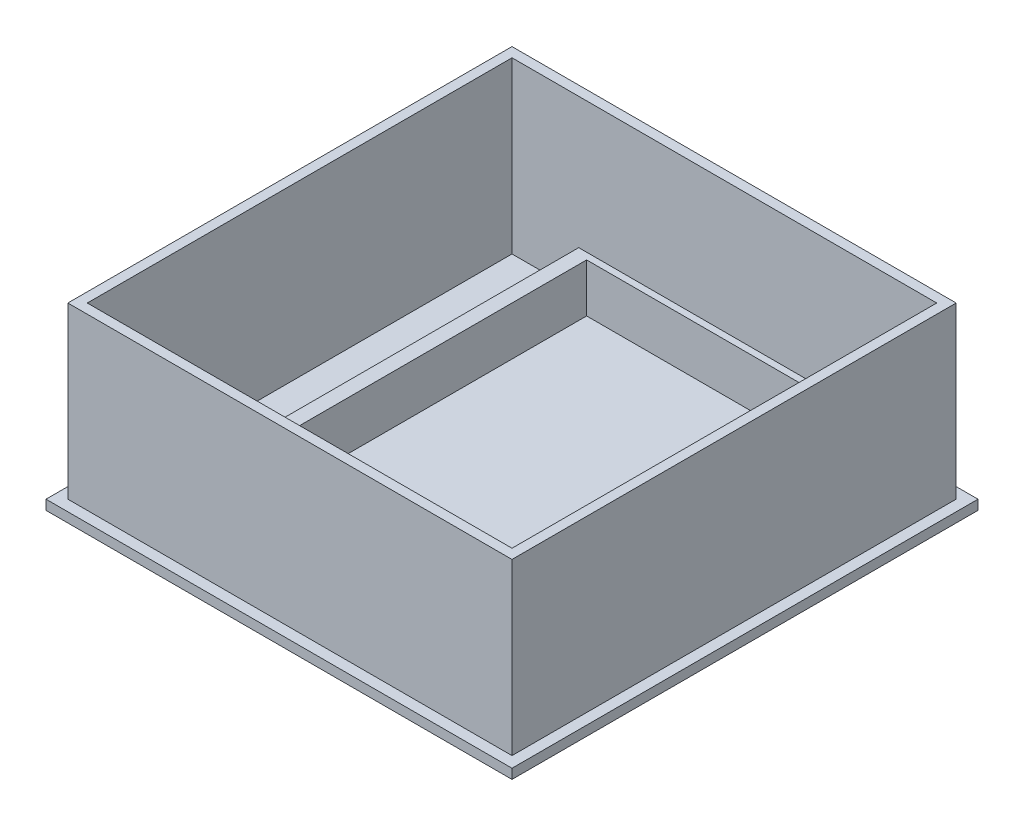
ISO-10303-21;
HEADER;
FILE_DESCRIPTION(('STEP AP214'),'2;1');
FILE_NAME('part.step','',(''),(''),'','','');
FILE_SCHEMA(('AUTOMOTIVE_DESIGN { 1 0 10303 214 1 1 1 1 }'));
ENDSEC;
DATA;
#1=APPLICATION_CONTEXT('core data for automotive mechanical design processes');
#2=APPLICATION_PROTOCOL_DEFINITION('international standard','automotive_design',2000,#1);
#3=PRODUCT_CONTEXT('',#1,'mechanical');
#4=PRODUCT('Part','Part','',(#3));
#5=PRODUCT_RELATED_PRODUCT_CATEGORY('part','',(#4));
#6=PRODUCT_DEFINITION_FORMATION('','',#4);
#7=PRODUCT_DEFINITION_CONTEXT('part definition',#1,'design');
#8=PRODUCT_DEFINITION('design','',#6,#7);
#9=PRODUCT_DEFINITION_SHAPE('','',#8);
#10=(LENGTH_UNIT() NAMED_UNIT(*) SI_UNIT(.MILLI.,.METRE.));
#11=(NAMED_UNIT(*) PLANE_ANGLE_UNIT() SI_UNIT($,.RADIAN.));
#12=(NAMED_UNIT(*) SI_UNIT($,.STERADIAN.) SOLID_ANGLE_UNIT());
#13=UNCERTAINTY_MEASURE_WITH_UNIT(LENGTH_MEASURE(1.E-05),#10,'distance_accuracy_value','');
#14=(GEOMETRIC_REPRESENTATION_CONTEXT(3) GLOBAL_UNCERTAINTY_ASSIGNED_CONTEXT((#13)) GLOBAL_UNIT_ASSIGNED_CONTEXT((#10,
#11,#12)) REPRESENTATION_CONTEXT('',''));
#15=CARTESIAN_POINT('',(0.,0.,0.));
#16=DIRECTION('',(0.,0.,1.));
#17=DIRECTION('',(1.,0.,0.));
#18=AXIS2_PLACEMENT_3D('',#15,#16,#17);
#19=CARTESIAN_POINT('',(0.,4.,0.));
#20=DIRECTION('',(0.,-1.,0.));
#21=DIRECTION('',(0.,0.,-1.));
#22=AXIS2_PLACEMENT_3D('',#19,#20,#21);
#23=PLANE('',#22);
#24=DIRECTION('',(0.,0.,1.));
#25=VECTOR('',#24,1.);
#26=CARTESIAN_POINT('',(-45.75,4.,-45.75));
#27=LINE('',#26,#25);
#28=CARTESIAN_POINT('',(-45.75,4.,-45.75));
#29=VERTEX_POINT('',#28);
#30=CARTESIAN_POINT('',(-45.75,4.,45.75));
#31=VERTEX_POINT('',#30);
#32=EDGE_CURVE('E511',#29,#31,#27,.T.);
#33=ORIENTED_EDGE('',*,*,#32,.F.);
#34=DIRECTION('',(-1.,0.,0.));
#35=VECTOR('',#34,1.);
#36=CARTESIAN_POINT('',(45.75,4.,-45.75));
#37=LINE('',#36,#35);
#38=CARTESIAN_POINT('',(45.75,4.,-45.75));
#39=VERTEX_POINT('',#38);
#40=EDGE_CURVE('E523',#39,#29,#37,.T.);
#41=ORIENTED_EDGE('',*,*,#40,.F.);
#42=DIRECTION('',(0.,0.,-1.));
#43=VECTOR('',#42,1.);
#44=CARTESIAN_POINT('',(45.75,4.,45.75));
#45=LINE('',#44,#43);
#46=CARTESIAN_POINT('',(45.75,4.,45.75));
#47=VERTEX_POINT('',#46);
#48=EDGE_CURVE('E520',#47,#39,#45,.T.);
#49=ORIENTED_EDGE('',*,*,#48,.F.);
#50=DIRECTION('',(1.,0.,0.));
#51=VECTOR('',#50,1.);
#52=CARTESIAN_POINT('',(-45.75,4.,45.75));
#53=LINE('',#52,#51);
#54=EDGE_CURVE('E479',#31,#47,#53,.T.);
#55=ORIENTED_EDGE('',*,*,#54,.F.);
#56=EDGE_LOOP('',(#33,#41,#49,#55));
#57=FACE_BOUND('',#56,.T.);
#58=DIRECTION('',(0.,0.,1.));
#59=VECTOR('',#58,1.);
#60=CARTESIAN_POINT('',(-48.,4.,-48.));
#61=LINE('',#60,#59);
#62=CARTESIAN_POINT('',(-48.,4.,-48.));
#63=VERTEX_POINT('',#62);
#64=CARTESIAN_POINT('',(-48.,4.,48.));
#65=VERTEX_POINT('',#64);
#66=EDGE_CURVE('E938',#63,#65,#61,.T.);
#67=ORIENTED_EDGE('',*,*,#66,.T.);
#68=DIRECTION('',(1.,0.,0.));
#69=VECTOR('',#68,1.);
#70=CARTESIAN_POINT('',(-48.,4.,48.));
#71=LINE('',#70,#69);
#72=CARTESIAN_POINT('',(48.,4.,48.));
#73=VERTEX_POINT('',#72);
#74=EDGE_CURVE('E402',#65,#73,#71,.T.);
#75=ORIENTED_EDGE('',*,*,#74,.T.);
#76=DIRECTION('',(0.,0.,-1.));
#77=VECTOR('',#76,1.);
#78=CARTESIAN_POINT('',(48.,4.,-48.));
#79=LINE('',#78,#77);
#80=CARTESIAN_POINT('',(48.,4.,-48.));
#81=VERTEX_POINT('',#80);
#82=EDGE_CURVE('E409',#73,#81,#79,.T.);
#83=ORIENTED_EDGE('',*,*,#82,.T.);
#84=DIRECTION('',(-1.,0.,0.));
#85=VECTOR('',#84,1.);
#86=CARTESIAN_POINT('',(-48.,4.,-48.));
#87=LINE('',#86,#85);
#88=EDGE_CURVE('E404',#81,#63,#87,.T.);
#89=ORIENTED_EDGE('',*,*,#88,.T.);
#90=EDGE_LOOP('',(#67,#75,#83,#89));
#91=FACE_BOUND('',#90,.T.);
#92=ADVANCED_FACE('F250',(#57,#91),#23,.F.);
#93=CARTESIAN_POINT('',(0.,39.,0.));
#94=DIRECTION('',(0.,1.,0.));
#95=DIRECTION('',(0.,0.,1.));
#96=AXIS2_PLACEMENT_3D('',#93,#94,#95);
#97=PLANE('',#96);
#98=DIRECTION('',(0.,0.,1.));
#99=VECTOR('',#98,1.);
#100=CARTESIAN_POINT('',(-43.7452454031839,39.,-43.75));
#101=LINE('',#100,#99);
#102=CARTESIAN_POINT('',(-43.7452454031839,39.,-43.75));
#103=VERTEX_POINT('',#102);
#104=CARTESIAN_POINT('',(-43.7452454031839,39.,43.75));
#105=VERTEX_POINT('',#104);
#106=EDGE_CURVE('E435',#103,#105,#101,.T.);
#107=ORIENTED_EDGE('',*,*,#106,.F.);
#108=DIRECTION('',(-1.,0.,0.));
#109=VECTOR('',#108,1.);
#110=CARTESIAN_POINT('',(-43.7452454031839,39.,-43.75));
#111=LINE('',#110,#109);
#112=CARTESIAN_POINT('',(43.75,39.,-43.75));
#113=VERTEX_POINT('',#112);
#114=EDGE_CURVE('E443',#113,#103,#111,.T.);
#115=ORIENTED_EDGE('',*,*,#114,.F.);
#116=DIRECTION('',(0.,0.,-1.));
#117=VECTOR('',#116,1.);
#118=CARTESIAN_POINT('',(43.75,39.,-43.75));
#119=LINE('',#118,#117);
#120=CARTESIAN_POINT('',(43.75,39.,43.75));
#121=VERTEX_POINT('',#120);
#122=EDGE_CURVE('E440',#121,#113,#119,.T.);
#123=ORIENTED_EDGE('',*,*,#122,.F.);
#124=DIRECTION('',(1.,0.,0.));
#125=VECTOR('',#124,1.);
#126=CARTESIAN_POINT('',(-43.7452454031839,39.,43.75));
#127=LINE('',#126,#125);
#128=EDGE_CURVE('E437',#105,#121,#127,.T.);
#129=ORIENTED_EDGE('',*,*,#128,.F.);
#130=EDGE_LOOP('',(#107,#115,#123,#129));
#131=FACE_BOUND('',#130,.T.);
#132=DIRECTION('',(1.,0.,0.));
#133=VECTOR('',#132,1.);
#134=CARTESIAN_POINT('',(-45.75,39.,45.75));
#135=LINE('',#134,#133);
#136=CARTESIAN_POINT('',(-45.75,39.,45.75));
#137=VERTEX_POINT('',#136);
#138=CARTESIAN_POINT('',(45.75,39.,45.75));
#139=VERTEX_POINT('',#138);
#140=EDGE_CURVE('E507',#137,#139,#135,.T.);
#141=ORIENTED_EDGE('',*,*,#140,.T.);
#142=DIRECTION('',(0.,0.,-1.));
#143=VECTOR('',#142,1.);
#144=CARTESIAN_POINT('',(45.75,39.,45.75));
#145=LINE('',#144,#143);
#146=CARTESIAN_POINT('',(45.75,39.,-45.75));
#147=VERTEX_POINT('',#146);
#148=EDGE_CURVE('E510',#139,#147,#145,.T.);
#149=ORIENTED_EDGE('',*,*,#148,.T.);
#150=DIRECTION('',(-1.,0.,0.));
#151=VECTOR('',#150,1.);
#152=CARTESIAN_POINT('',(45.75,39.,-45.75));
#153=LINE('',#152,#151);
#154=CARTESIAN_POINT('',(-45.75,39.,-45.75));
#155=VERTEX_POINT('',#154);
#156=EDGE_CURVE('E513',#147,#155,#153,.T.);
#157=ORIENTED_EDGE('',*,*,#156,.T.);
#158=DIRECTION('',(0.,0.,1.));
#159=VECTOR('',#158,1.);
#160=CARTESIAN_POINT('',(-45.75,39.,-45.75));
#161=LINE('',#160,#159);
#162=EDGE_CURVE('E515',#155,#137,#161,.T.);
#163=ORIENTED_EDGE('',*,*,#162,.T.);
#164=EDGE_LOOP('',(#141,#149,#157,#163));
#165=FACE_BOUND('',#164,.T.);
#166=ADVANCED_FACE('F554',(#131,#165),#97,.T.);
#167=CARTESIAN_POINT('',(-45.75,39.,45.75));
#168=DIRECTION('',(0.,0.,-1.));
#169=DIRECTION('',(-1.,0.,0.));
#170=AXIS2_PLACEMENT_3D('',#167,#168,#169);
#171=PLANE('',#170);
#172=ORIENTED_EDGE('',*,*,#54,.T.);
#173=DIRECTION('',(0.,-1.,0.));
#174=VECTOR('',#173,1.);
#175=CARTESIAN_POINT('',(45.75,39.,45.75));
#176=LINE('',#175,#174);
#177=EDGE_CURVE('E258',#139,#47,#176,.T.);
#178=ORIENTED_EDGE('',*,*,#177,.F.);
#179=ORIENTED_EDGE('',*,*,#140,.F.);
#180=DIRECTION('',(0.,-1.,0.));
#181=VECTOR('',#180,1.);
#182=CARTESIAN_POINT('',(-45.75,39.,45.75));
#183=LINE('',#182,#181);
#184=EDGE_CURVE('E517',#137,#31,#183,.T.);
#185=ORIENTED_EDGE('',*,*,#184,.T.);
#186=EDGE_LOOP('',(#172,#178,#179,#185));
#187=FACE_BOUND('',#186,.T.);
#188=ADVANCED_FACE('F541',(#187),#171,.F.);
#189=CARTESIAN_POINT('',(45.75,39.,45.75));
#190=DIRECTION('',(-1.,0.,0.));
#191=DIRECTION('',(0.,0.,1.));
#192=AXIS2_PLACEMENT_3D('',#189,#190,#191);
#193=PLANE('',#192);
#194=ORIENTED_EDGE('',*,*,#48,.T.);
#195=DIRECTION('',(0.,-1.,0.));
#196=VECTOR('',#195,1.);
#197=CARTESIAN_POINT('',(45.75,39.,-45.75));
#198=LINE('',#197,#196);
#199=EDGE_CURVE('E532',#147,#39,#198,.T.);
#200=ORIENTED_EDGE('',*,*,#199,.F.);
#201=ORIENTED_EDGE('',*,*,#148,.F.);
#202=ORIENTED_EDGE('',*,*,#177,.T.);
#203=EDGE_LOOP('',(#194,#200,#201,#202));
#204=FACE_BOUND('',#203,.T.);
#205=ADVANCED_FACE('F537',(#204),#193,.F.);
#206=CARTESIAN_POINT('',(45.75,39.,-45.75));
#207=DIRECTION('',(0.,0.,1.));
#208=DIRECTION('',(1.,0.,0.));
#209=AXIS2_PLACEMENT_3D('',#206,#207,#208);
#210=PLANE('',#209);
#211=ORIENTED_EDGE('',*,*,#40,.T.);
#212=DIRECTION('',(0.,-1.,0.));
#213=VECTOR('',#212,1.);
#214=CARTESIAN_POINT('',(-45.75,39.,-45.75));
#215=LINE('',#214,#213);
#216=EDGE_CURVE('E529',#155,#29,#215,.T.);
#217=ORIENTED_EDGE('',*,*,#216,.F.);
#218=ORIENTED_EDGE('',*,*,#156,.F.);
#219=ORIENTED_EDGE('',*,*,#199,.T.);
#220=EDGE_LOOP('',(#211,#217,#218,#219));
#221=FACE_BOUND('',#220,.T.);
#222=ADVANCED_FACE('F552',(#221),#210,.F.);
#223=CARTESIAN_POINT('',(-45.75,39.,-45.75));
#224=DIRECTION('',(1.,0.,0.));
#225=DIRECTION('',(0.,0.,-1.));
#226=AXIS2_PLACEMENT_3D('',#223,#224,#225);
#227=PLANE('',#226);
#228=ORIENTED_EDGE('',*,*,#32,.T.);
#229=ORIENTED_EDGE('',*,*,#184,.F.);
#230=ORIENTED_EDGE('',*,*,#162,.F.);
#231=ORIENTED_EDGE('',*,*,#216,.T.);
#232=EDGE_LOOP('',(#228,#229,#230,#231));
#233=FACE_BOUND('',#232,.T.);
#234=ADVANCED_FACE('F547',(#233),#227,.F.);
#235=CARTESIAN_POINT('',(-43.7452454031839,-109.740324745668,-43.75));
#236=DIRECTION('',(-1.,0.,0.));
#237=DIRECTION('',(0.,0.,1.));
#238=AXIS2_PLACEMENT_3D('',#235,#236,#237);
#239=PLANE('',#238);
#240=DIRECTION('',(0.,1.,0.));
#241=VECTOR('',#240,1.);
#242=CARTESIAN_POINT('',(-43.7452454031839,-109.740324745668,43.75));
#243=LINE('',#242,#241);
#244=CARTESIAN_POINT('',(-43.7452454031839,4.,43.75));
#245=VERTEX_POINT('',#244);
#246=EDGE_CURVE('E446',#245,#105,#243,.T.);
#247=ORIENTED_EDGE('',*,*,#246,.F.);
#248=DIRECTION('',(0.,0.,1.));
#249=VECTOR('',#248,1.);
#250=CARTESIAN_POINT('',(-43.7452454031839,4.,-43.75));
#251=LINE('',#250,#249);
#252=CARTESIAN_POINT('',(-43.7452454031839,4.,-43.75));
#253=VERTEX_POINT('',#252);
#254=EDGE_CURVE('E424',#253,#245,#251,.T.);
#255=ORIENTED_EDGE('',*,*,#254,.F.);
#256=DIRECTION('',(0.,1.,0.));
#257=VECTOR('',#256,1.);
#258=CARTESIAN_POINT('',(-43.7452454031839,-109.740324745668,-43.75));
#259=LINE('',#258,#257);
#260=EDGE_CURVE('E447',#253,#103,#259,.T.);
#261=ORIENTED_EDGE('',*,*,#260,.T.);
#262=ORIENTED_EDGE('',*,*,#106,.T.);
#263=EDGE_LOOP('',(#247,#255,#261,#262));
#264=FACE_BOUND('',#263,.T.);
#265=ADVANCED_FACE('F572',(#264),#239,.F.);
#266=CARTESIAN_POINT('',(-43.7452454031839,-109.740324745668,-43.75));
#267=DIRECTION('',(0.,0.,-1.));
#268=DIRECTION('',(-1.,0.,0.));
#269=AXIS2_PLACEMENT_3D('',#266,#267,#268);
#270=PLANE('',#269);
#271=ORIENTED_EDGE('',*,*,#260,.F.);
#272=DIRECTION('',(1.,0.,0.));
#273=VECTOR('',#272,1.);
#274=CARTESIAN_POINT('',(-43.7452454031839,4.,-43.75));
#275=LINE('',#274,#273);
#276=CARTESIAN_POINT('',(43.75,4.,-43.75));
#277=VERTEX_POINT('',#276);
#278=EDGE_CURVE('E421',#253,#277,#275,.T.);
#279=ORIENTED_EDGE('',*,*,#278,.T.);
#280=DIRECTION('',(0.,1.,0.));
#281=VECTOR('',#280,1.);
#282=CARTESIAN_POINT('',(43.75,-109.740324745668,-43.75));
#283=LINE('',#282,#281);
#284=EDGE_CURVE('E450',#277,#113,#283,.T.);
#285=ORIENTED_EDGE('',*,*,#284,.T.);
#286=ORIENTED_EDGE('',*,*,#114,.T.);
#287=EDGE_LOOP('',(#271,#279,#285,#286));
#288=FACE_BOUND('',#287,.T.);
#289=ADVANCED_FACE('F600',(#288),#270,.F.);
#290=CARTESIAN_POINT('',(43.75,-109.740324745668,-43.75));
#291=DIRECTION('',(1.,0.,0.));
#292=DIRECTION('',(0.,0.,-1.));
#293=AXIS2_PLACEMENT_3D('',#290,#291,#292);
#294=PLANE('',#293);
#295=ORIENTED_EDGE('',*,*,#284,.F.);
#296=DIRECTION('',(0.,0.,1.));
#297=VECTOR('',#296,1.);
#298=CARTESIAN_POINT('',(43.75,4.,-43.75));
#299=LINE('',#298,#297);
#300=CARTESIAN_POINT('',(43.75,4.,43.75));
#301=VERTEX_POINT('',#300);
#302=EDGE_CURVE('E418',#277,#301,#299,.T.);
#303=ORIENTED_EDGE('',*,*,#302,.T.);
#304=DIRECTION('',(0.,1.,0.));
#305=VECTOR('',#304,1.);
#306=CARTESIAN_POINT('',(43.75,-109.740324745668,43.75));
#307=LINE('',#306,#305);
#308=EDGE_CURVE('E452',#301,#121,#307,.T.);
#309=ORIENTED_EDGE('',*,*,#308,.T.);
#310=ORIENTED_EDGE('',*,*,#122,.T.);
#311=EDGE_LOOP('',(#295,#303,#309,#310));
#312=FACE_BOUND('',#311,.T.);
#313=ADVANCED_FACE('F608',(#312),#294,.F.);
#314=CARTESIAN_POINT('',(-43.7452454031839,-109.740324745668,43.75));
#315=DIRECTION('',(0.,0.,1.));
#316=DIRECTION('',(1.,0.,0.));
#317=AXIS2_PLACEMENT_3D('',#314,#315,#316);
#318=PLANE('',#317);
#319=ORIENTED_EDGE('',*,*,#308,.F.);
#320=DIRECTION('',(1.,0.,0.));
#321=VECTOR('',#320,1.);
#322=CARTESIAN_POINT('',(-43.7452454031839,4.,43.75));
#323=LINE('',#322,#321);
#324=EDGE_CURVE('E427',#245,#301,#323,.T.);
#325=ORIENTED_EDGE('',*,*,#324,.F.);
#326=ORIENTED_EDGE('',*,*,#246,.T.);
#327=ORIENTED_EDGE('',*,*,#128,.T.);
#328=EDGE_LOOP('',(#319,#325,#326,#327));
#329=FACE_BOUND('',#328,.T.);
#330=ADVANCED_FACE('F616',(#329),#318,.F.);
#331=CARTESIAN_POINT('',(-41.75,-119.740324745668,-41.75));
#332=DIRECTION('',(0.,0.,1.));
#333=DIRECTION('',(1.,0.,0.));
#334=AXIS2_PLACEMENT_3D('',#331,#332,#333);
#335=PLANE('',#334);
#336=DIRECTION('',(1.,0.,0.));
#337=VECTOR('',#336,1.);
#338=CARTESIAN_POINT('',(-41.75,4.,-41.75));
#339=LINE('',#338,#337);
#340=CARTESIAN_POINT('',(-28.,4.,-41.75));
#341=VERTEX_POINT('',#340);
#342=CARTESIAN_POINT('',(28.,4.,-41.75));
#343=VERTEX_POINT('',#342);
#344=EDGE_CURVE('E413',#341,#343,#339,.T.);
#345=ORIENTED_EDGE('',*,*,#344,.F.);
#346=DIRECTION('',(0.,-1.,0.));
#347=VECTOR('',#346,1.);
#348=CARTESIAN_POINT('',(-28.,14.,-41.75));
#349=LINE('',#348,#347);
#350=CARTESIAN_POINT('',(-28.,14.,-41.75));
#351=VERTEX_POINT('',#350);
#352=EDGE_CURVE('E471',#351,#341,#349,.T.);
#353=ORIENTED_EDGE('',*,*,#352,.F.);
#354=DIRECTION('',(1.,0.,0.));
#355=VECTOR('',#354,1.);
#356=CARTESIAN_POINT('',(-41.75,14.,-41.75));
#357=LINE('',#356,#355);
#358=CARTESIAN_POINT('',(28.,14.,-41.75));
#359=VERTEX_POINT('',#358);
#360=EDGE_CURVE('E433',#351,#359,#357,.T.);
#361=ORIENTED_EDGE('',*,*,#360,.T.);
#362=DIRECTION('',(0.,-1.,0.));
#363=VECTOR('',#362,1.);
#364=CARTESIAN_POINT('',(28.,14.,-41.75));
#365=LINE('',#364,#363);
#366=EDGE_CURVE('E475',#359,#343,#365,.T.);
#367=ORIENTED_EDGE('',*,*,#366,.T.);
#368=EDGE_LOOP('',(#345,#353,#361,#367));
#369=FACE_BOUND('',#368,.T.);
#370=ADVANCED_FACE('F624',(#369),#335,.F.);
#371=CARTESIAN_POINT('',(-41.75,-119.740324745668,41.75));
#372=DIRECTION('',(0.,0.,1.));
#373=DIRECTION('',(1.,0.,0.));
#374=AXIS2_PLACEMENT_3D('',#371,#372,#373);
#375=PLANE('',#374);
#376=DIRECTION('',(0.,-1.,0.));
#377=VECTOR('',#376,1.);
#378=CARTESIAN_POINT('',(28.,14.,41.75));
#379=LINE('',#378,#377);
#380=CARTESIAN_POINT('',(28.,14.,41.75));
#381=VERTEX_POINT('',#380);
#382=CARTESIAN_POINT('',(28.,4.,41.75));
#383=VERTEX_POINT('',#382);
#384=EDGE_CURVE('E489',#381,#383,#379,.T.);
#385=ORIENTED_EDGE('',*,*,#384,.F.);
#386=DIRECTION('',(1.,0.,0.));
#387=VECTOR('',#386,1.);
#388=CARTESIAN_POINT('',(-41.75,14.,41.75));
#389=LINE('',#388,#387);
#390=CARTESIAN_POINT('',(-28.,14.,41.75));
#391=VERTEX_POINT('',#390);
#392=EDGE_CURVE('E430',#391,#381,#389,.T.);
#393=ORIENTED_EDGE('',*,*,#392,.F.);
#394=DIRECTION('',(0.,-1.,0.));
#395=VECTOR('',#394,1.);
#396=CARTESIAN_POINT('',(-28.,14.,41.75));
#397=LINE('',#396,#395);
#398=CARTESIAN_POINT('',(-28.,4.,41.75));
#399=VERTEX_POINT('',#398);
#400=EDGE_CURVE('E464',#391,#399,#397,.T.);
#401=ORIENTED_EDGE('',*,*,#400,.T.);
#402=DIRECTION('',(1.,0.,0.));
#403=VECTOR('',#402,1.);
#404=CARTESIAN_POINT('',(-41.75,4.,41.75));
#405=LINE('',#404,#403);
#406=EDGE_CURVE('E416',#399,#383,#405,.T.);
#407=ORIENTED_EDGE('',*,*,#406,.T.);
#408=EDGE_LOOP('',(#385,#393,#401,#407));
#409=FACE_BOUND('',#408,.T.);
#410=ADVANCED_FACE('F632',(#409),#375,.T.);
#411=DIRECTION('',(0.,0.,-1.));
#412=VECTOR('',#411,1.);
#413=CARTESIAN_POINT('',(-25.,4.,0.));
#414=LINE('',#413,#412);
#415=CARTESIAN_POINT('',(-25.,4.,39.));
#416=VERTEX_POINT('',#415);
#417=CARTESIAN_POINT('',(-25.,4.,-40.375));
#418=VERTEX_POINT('',#417);
#419=EDGE_CURVE('E469',#416,#418,#414,.T.);
#420=ORIENTED_EDGE('',*,*,#419,.F.);
#421=DIRECTION('',(1.,0.,0.));
#422=VECTOR('',#421,1.);
#423=CARTESIAN_POINT('',(0.,4.,39.));
#424=LINE('',#423,#422);
#425=CARTESIAN_POINT('',(25.,4.,39.));
#426=VERTEX_POINT('',#425);
#427=EDGE_CURVE('E496',#416,#426,#424,.T.);
#428=ORIENTED_EDGE('',*,*,#427,.T.);
#429=DIRECTION('',(0.,0.,-1.));
#430=VECTOR('',#429,1.);
#431=CARTESIAN_POINT('',(25.,4.,0.));
#432=LINE('',#431,#430);
#433=CARTESIAN_POINT('',(25.,4.,-40.375));
#434=VERTEX_POINT('',#433);
#435=EDGE_CURVE('E484',#426,#434,#432,.T.);
#436=ORIENTED_EDGE('',*,*,#435,.T.);
#437=DIRECTION('',(-1.,0.,0.));
#438=VECTOR('',#437,1.);
#439=CARTESIAN_POINT('',(-25.,4.,-40.375));
#440=LINE('',#439,#438);
#441=EDGE_CURVE('E449',#434,#418,#440,.T.);
#442=ORIENTED_EDGE('',*,*,#441,.T.);
#443=EDGE_LOOP('',(#420,#428,#436,#442));
#444=FACE_BOUND('',#443,.T.);
#445=ADVANCED_FACE('F564',(#444),#23,.F.);
#446=CARTESIAN_POINT('',(0.,14.,39.));
#447=DIRECTION('',(0.,0.,-1.));
#448=DIRECTION('',(-1.,0.,0.));
#449=AXIS2_PLACEMENT_3D('',#446,#447,#448);
#450=PLANE('',#449);
#451=ORIENTED_EDGE('',*,*,#427,.F.);
#452=DIRECTION('',(0.,-1.,0.));
#453=VECTOR('',#452,1.);
#454=CARTESIAN_POINT('',(-25.,14.,39.));
#455=LINE('',#454,#453);
#456=CARTESIAN_POINT('',(-25.,14.,39.));
#457=VERTEX_POINT('',#456);
#458=EDGE_CURVE('E499',#457,#416,#455,.T.);
#459=ORIENTED_EDGE('',*,*,#458,.F.);
#460=DIRECTION('',(1.,0.,0.));
#461=VECTOR('',#460,1.);
#462=CARTESIAN_POINT('',(0.,14.,39.));
#463=LINE('',#462,#461);
#464=CARTESIAN_POINT('',(25.,14.,39.));
#465=VERTEX_POINT('',#464);
#466=EDGE_CURVE('E492',#457,#465,#463,.T.);
#467=ORIENTED_EDGE('',*,*,#466,.T.);
#468=DIRECTION('',(0.,-1.,0.));
#469=VECTOR('',#468,1.);
#470=CARTESIAN_POINT('',(25.,14.,39.));
#471=LINE('',#470,#469);
#472=EDGE_CURVE('E495',#465,#426,#471,.T.);
#473=ORIENTED_EDGE('',*,*,#472,.T.);
#474=EDGE_LOOP('',(#451,#459,#467,#473));
#475=FACE_BOUND('',#474,.T.);
#476=ADVANCED_FACE('F568',(#475),#450,.T.);
#477=CARTESIAN_POINT('',(25.,14.,0.));
#478=DIRECTION('',(-1.,0.,0.));
#479=DIRECTION('',(0.,0.,1.));
#480=AXIS2_PLACEMENT_3D('',#477,#478,#479);
#481=PLANE('',#480);
#482=ORIENTED_EDGE('',*,*,#435,.F.);
#483=ORIENTED_EDGE('',*,*,#472,.F.);
#484=DIRECTION('',(0.,0.,-1.));
#485=VECTOR('',#484,1.);
#486=CARTESIAN_POINT('',(25.,14.,0.));
#487=LINE('',#486,#485);
#488=CARTESIAN_POINT('',(25.,14.,-40.375));
#489=VERTEX_POINT('',#488);
#490=EDGE_CURVE('E483',#465,#489,#487,.T.);
#491=ORIENTED_EDGE('',*,*,#490,.T.);
#492=DIRECTION('',(0.,-1.,0.));
#493=VECTOR('',#492,1.);
#494=CARTESIAN_POINT('',(25.,39.,-40.375));
#495=LINE('',#494,#493);
#496=EDGE_CURVE('E461',#489,#434,#495,.T.);
#497=ORIENTED_EDGE('',*,*,#496,.T.);
#498=EDGE_LOOP('',(#482,#483,#491,#497));
#499=FACE_BOUND('',#498,.T.);
#500=ADVANCED_FACE('F654',(#499),#481,.T.);
#501=CARTESIAN_POINT('',(-25.,39.,-40.375));
#502=DIRECTION('',(0.,0.,1.));
#503=DIRECTION('',(1.,0.,0.));
#504=AXIS2_PLACEMENT_3D('',#501,#502,#503);
#505=PLANE('',#504);
#506=DIRECTION('',(0.,-1.,0.));
#507=VECTOR('',#506,1.);
#508=CARTESIAN_POINT('',(-25.,39.,-40.375));
#509=LINE('',#508,#507);
#510=CARTESIAN_POINT('',(-25.,14.,-40.375));
#511=VERTEX_POINT('',#510);
#512=EDGE_CURVE('E458',#511,#418,#509,.T.);
#513=ORIENTED_EDGE('',*,*,#512,.T.);
#514=ORIENTED_EDGE('',*,*,#441,.F.);
#515=ORIENTED_EDGE('',*,*,#496,.F.);
#516=DIRECTION('',(1.,0.,0.));
#517=VECTOR('',#516,1.);
#518=CARTESIAN_POINT('',(0.,14.,-40.375));
#519=LINE('',#518,#517);
#520=EDGE_CURVE('E13',#511,#489,#519,.T.);
#521=ORIENTED_EDGE('',*,*,#520,.F.);
#522=EDGE_LOOP('',(#513,#514,#515,#521));
#523=FACE_BOUND('',#522,.T.);
#524=ADVANCED_FACE('F661',(#523),#505,.T.);
#525=CARTESIAN_POINT('',(-25.,14.,0.));
#526=DIRECTION('',(-1.,0.,0.));
#527=DIRECTION('',(0.,0.,1.));
#528=AXIS2_PLACEMENT_3D('',#525,#526,#527);
#529=PLANE('',#528);
#530=ORIENTED_EDGE('',*,*,#419,.T.);
#531=ORIENTED_EDGE('',*,*,#512,.F.);
#532=DIRECTION('',(0.,0.,-1.));
#533=VECTOR('',#532,1.);
#534=CARTESIAN_POINT('',(-25.,14.,0.));
#535=LINE('',#534,#533);
#536=EDGE_CURVE('E468',#457,#511,#535,.T.);
#537=ORIENTED_EDGE('',*,*,#536,.F.);
#538=ORIENTED_EDGE('',*,*,#458,.T.);
#539=EDGE_LOOP('',(#530,#531,#537,#538));
#540=FACE_BOUND('',#539,.T.);
#541=ADVANCED_FACE('F668',(#540),#529,.F.);
#542=ORIENTED_EDGE('',*,*,#344,.T.);
#543=DIRECTION('',(0.,0.,-1.));
#544=VECTOR('',#543,1.);
#545=CARTESIAN_POINT('',(28.,4.,0.));
#546=LINE('',#545,#544);
#547=EDGE_CURVE('E486',#383,#343,#546,.T.);
#548=ORIENTED_EDGE('',*,*,#547,.F.);
#549=ORIENTED_EDGE('',*,*,#406,.F.);
#550=DIRECTION('',(0.,0.,-1.));
#551=VECTOR('',#550,1.);
#552=CARTESIAN_POINT('',(-28.,4.,0.));
#553=LINE('',#552,#551);
#554=EDGE_CURVE('E472',#399,#341,#553,.T.);
#555=ORIENTED_EDGE('',*,*,#554,.T.);
#556=EDGE_LOOP('',(#542,#548,#549,#555));
#557=FACE_BOUND('',#556,.T.);
#558=ORIENTED_EDGE('',*,*,#324,.T.);
#559=ORIENTED_EDGE('',*,*,#302,.F.);
#560=ORIENTED_EDGE('',*,*,#278,.F.);
#561=ORIENTED_EDGE('',*,*,#254,.T.);
#562=EDGE_LOOP('',(#558,#559,#560,#561));
#563=FACE_BOUND('',#562,.T.);
#564=ADVANCED_FACE('F252',(#557,#563),#23,.F.);
#565=CARTESIAN_POINT('',(-28.,14.,0.));
#566=DIRECTION('',(-1.,0.,0.));
#567=DIRECTION('',(0.,0.,1.));
#568=AXIS2_PLACEMENT_3D('',#565,#566,#567);
#569=PLANE('',#568);
#570=ORIENTED_EDGE('',*,*,#554,.F.);
#571=ORIENTED_EDGE('',*,*,#400,.F.);
#572=DIRECTION('',(0.,0.,-1.));
#573=VECTOR('',#572,1.);
#574=CARTESIAN_POINT('',(-28.,14.,0.));
#575=LINE('',#574,#573);
#576=EDGE_CURVE('E465',#391,#351,#575,.T.);
#577=ORIENTED_EDGE('',*,*,#576,.T.);
#578=ORIENTED_EDGE('',*,*,#352,.T.);
#579=EDGE_LOOP('',(#570,#571,#577,#578));
#580=FACE_BOUND('',#579,.T.);
#581=ADVANCED_FACE('F681',(#580),#569,.T.);
#582=CARTESIAN_POINT('',(0.,14.,0.));
#583=DIRECTION('',(0.,1.,0.));
#584=DIRECTION('',(0.,0.,1.));
#585=AXIS2_PLACEMENT_3D('',#582,#583,#584);
#586=PLANE('',#585);
#587=ORIENTED_EDGE('',*,*,#360,.F.);
#588=ORIENTED_EDGE('',*,*,#576,.F.);
#589=ORIENTED_EDGE('',*,*,#392,.T.);
#590=DIRECTION('',(0.,0.,-1.));
#591=VECTOR('',#590,1.);
#592=CARTESIAN_POINT('',(28.,14.,0.));
#593=LINE('',#592,#591);
#594=EDGE_CURVE('E480',#381,#359,#593,.T.);
#595=ORIENTED_EDGE('',*,*,#594,.T.);
#596=EDGE_LOOP('',(#587,#588,#589,#595));
#597=FACE_BOUND('',#596,.T.);
#598=ORIENTED_EDGE('',*,*,#536,.T.);
#599=ORIENTED_EDGE('',*,*,#520,.T.);
#600=ORIENTED_EDGE('',*,*,#490,.F.);
#601=ORIENTED_EDGE('',*,*,#466,.F.);
#602=EDGE_LOOP('',(#598,#599,#600,#601));
#603=FACE_BOUND('',#602,.T.);
#604=ADVANCED_FACE('F688',(#597,#603),#586,.T.);
#605=CARTESIAN_POINT('',(28.,14.,0.));
#606=DIRECTION('',(-1.,0.,0.));
#607=DIRECTION('',(0.,0.,1.));
#608=AXIS2_PLACEMENT_3D('',#605,#606,#607);
#609=PLANE('',#608);
#610=ORIENTED_EDGE('',*,*,#547,.T.);
#611=ORIENTED_EDGE('',*,*,#366,.F.);
#612=ORIENTED_EDGE('',*,*,#594,.F.);
#613=ORIENTED_EDGE('',*,*,#384,.T.);
#614=EDGE_LOOP('',(#610,#611,#612,#613));
#615=FACE_BOUND('',#614,.T.);
#616=ADVANCED_FACE('F696',(#615),#609,.F.);
#617=CARTESIAN_POINT('',(-48.,-28.,-48.));
#618=DIRECTION('',(-1.,0.,0.));
#619=DIRECTION('',(0.,0.,1.));
#620=AXIS2_PLACEMENT_3D('',#617,#618,#619);
#621=PLANE('',#620);
#622=DIRECTION('',(0.,0.,-1.));
#623=VECTOR('',#622,1.);
#624=CARTESIAN_POINT('',(-48.,2.,48.));
#625=LINE('',#624,#623);
#626=CARTESIAN_POINT('',(-48.,2.,48.));
#627=VERTEX_POINT('',#626);
#628=CARTESIAN_POINT('',(-48.,2.,-48.));
#629=VERTEX_POINT('',#628);
#630=EDGE_CURVE('E388',#627,#629,#625,.T.);
#631=ORIENTED_EDGE('',*,*,#630,.F.);
#632=DIRECTION('',(0.,1.,0.));
#633=VECTOR('',#632,1.);
#634=CARTESIAN_POINT('',(-48.,-28.,48.));
#635=LINE('',#634,#633);
#636=EDGE_CURVE('E397',#627,#65,#635,.T.);
#637=ORIENTED_EDGE('',*,*,#636,.T.);
#638=ORIENTED_EDGE('',*,*,#66,.F.);
#639=DIRECTION('',(0.,1.,0.));
#640=VECTOR('',#639,1.);
#641=CARTESIAN_POINT('',(-48.,-28.,-48.));
#642=LINE('',#641,#640);
#643=EDGE_CURVE('E398',#629,#63,#642,.T.);
#644=ORIENTED_EDGE('',*,*,#643,.F.);
#645=EDGE_LOOP('',(#631,#637,#638,#644));
#646=FACE_BOUND('',#645,.T.);
#647=ADVANCED_FACE('F395',(#646),#621,.T.);
#648=CARTESIAN_POINT('',(-48.,-28.,-48.));
#649=DIRECTION('',(0.,0.,-1.));
#650=DIRECTION('',(-1.,0.,0.));
#651=AXIS2_PLACEMENT_3D('',#648,#649,#650);
#652=PLANE('',#651);
#653=DIRECTION('',(1.,0.,0.));
#654=VECTOR('',#653,1.);
#655=CARTESIAN_POINT('',(48.,2.,-48.));
#656=LINE('',#655,#654);
#657=CARTESIAN_POINT('',(48.,2.,-48.));
#658=VERTEX_POINT('',#657);
#659=EDGE_CURVE('E391',#629,#658,#656,.T.);
#660=ORIENTED_EDGE('',*,*,#659,.F.);
#661=ORIENTED_EDGE('',*,*,#643,.T.);
#662=ORIENTED_EDGE('',*,*,#88,.F.);
#663=DIRECTION('',(0.,1.,0.));
#664=VECTOR('',#663,1.);
#665=CARTESIAN_POINT('',(48.,-28.,-48.));
#666=LINE('',#665,#664);
#667=EDGE_CURVE('E406',#658,#81,#666,.T.);
#668=ORIENTED_EDGE('',*,*,#667,.F.);
#669=EDGE_LOOP('',(#660,#661,#662,#668));
#670=FACE_BOUND('',#669,.T.);
#671=ADVANCED_FACE('F708',(#670),#652,.T.);
#672=CARTESIAN_POINT('',(48.,-28.,-48.));
#673=DIRECTION('',(1.,0.,0.));
#674=DIRECTION('',(0.,0.,-1.));
#675=AXIS2_PLACEMENT_3D('',#672,#673,#674);
#676=PLANE('',#675);
#677=DIRECTION('',(0.,0.,-1.));
#678=VECTOR('',#677,1.);
#679=CARTESIAN_POINT('',(48.,2.,48.));
#680=LINE('',#679,#678);
#681=CARTESIAN_POINT('',(48.,2.,48.));
#682=VERTEX_POINT('',#681);
#683=EDGE_CURVE('E265',#682,#658,#680,.T.);
#684=ORIENTED_EDGE('',*,*,#683,.T.);
#685=ORIENTED_EDGE('',*,*,#667,.T.);
#686=ORIENTED_EDGE('',*,*,#82,.F.);
#687=DIRECTION('',(0.,1.,0.));
#688=VECTOR('',#687,1.);
#689=CARTESIAN_POINT('',(48.,-28.,48.));
#690=LINE('',#689,#688);
#691=EDGE_CURVE('E272',#682,#73,#690,.T.);
#692=ORIENTED_EDGE('',*,*,#691,.F.);
#693=EDGE_LOOP('',(#684,#685,#686,#692));
#694=FACE_BOUND('',#693,.T.);
#695=ADVANCED_FACE('F715',(#694),#676,.T.);
#696=CARTESIAN_POINT('',(-48.,-28.,48.));
#697=DIRECTION('',(0.,0.,1.));
#698=DIRECTION('',(1.,0.,0.));
#699=AXIS2_PLACEMENT_3D('',#696,#697,#698);
#700=PLANE('',#699);
#701=DIRECTION('',(1.,0.,0.));
#702=VECTOR('',#701,1.);
#703=CARTESIAN_POINT('',(48.,2.,48.));
#704=LINE('',#703,#702);
#705=EDGE_CURVE('E385',#627,#682,#704,.T.);
#706=ORIENTED_EDGE('',*,*,#705,.T.);
#707=ORIENTED_EDGE('',*,*,#691,.T.);
#708=ORIENTED_EDGE('',*,*,#74,.F.);
#709=ORIENTED_EDGE('',*,*,#636,.F.);
#710=EDGE_LOOP('',(#706,#707,#708,#709));
#711=FACE_BOUND('',#710,.T.);
#712=ADVANCED_FACE('F400',(#711),#700,.T.);
#713=CARTESIAN_POINT('',(48.,2.,48.));
#714=DIRECTION('',(0.,1.,0.));
#715=DIRECTION('',(0.,0.,1.));
#716=AXIS2_PLACEMENT_3D('',#713,#714,#715);
#717=PLANE('',#716);
#718=ORIENTED_EDGE('',*,*,#659,.T.);
#719=ORIENTED_EDGE('',*,*,#683,.F.);
#720=ORIENTED_EDGE('',*,*,#705,.F.);
#721=ORIENTED_EDGE('',*,*,#630,.T.);
#722=EDGE_LOOP('',(#718,#719,#720,#721));
#723=FACE_BOUND('',#722,.T.);
#724=ADVANCED_FACE('F387',(#723),#717,.F.);
#725=CLOSED_SHELL('',(#92,#166,#188,#205,#222,#234,#265,#289,#313,#330,#370,#410,#445,#476,#500,
#524,#541,#564,#581,#604,#616,#647,#671,#695,#712,#724));
#726=MANIFOLD_SOLID_BREP('B2',#725);
#727=ADVANCED_BREP_SHAPE_REPRESENTATION('',(#18,#726),#14);
#728=SHAPE_DEFINITION_REPRESENTATION(#9,#727);
ENDSEC;
END-ISO-10303-21;
